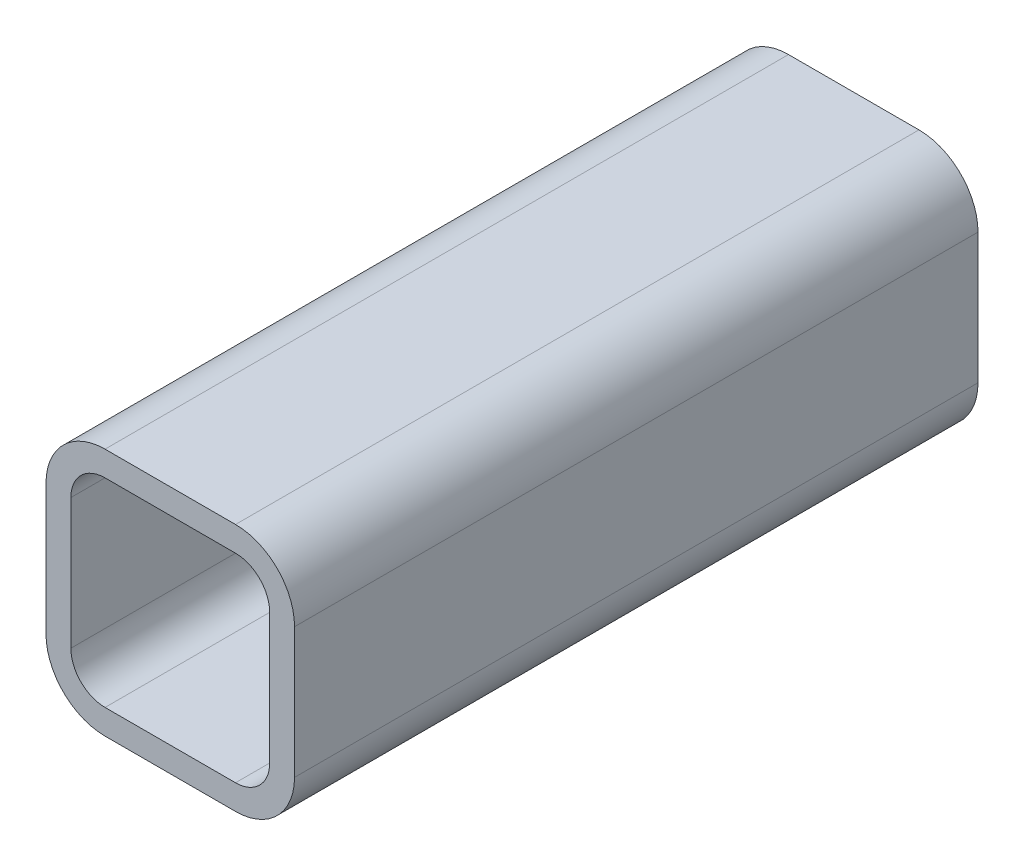
ISO-10303-21;
HEADER;
FILE_DESCRIPTION(('STEP AP214'),'2;1');
FILE_NAME('part.step','',(''),(''),'','','');
FILE_SCHEMA(('AUTOMOTIVE_DESIGN { 1 0 10303 214 1 1 1 1 }'));
ENDSEC;
DATA;
#1=APPLICATION_CONTEXT('core data for automotive mechanical design processes');
#2=APPLICATION_PROTOCOL_DEFINITION('international standard','automotive_design',2000,#1);
#3=PRODUCT_CONTEXT('',#1,'mechanical');
#4=PRODUCT('Part','Part','',(#3));
#5=PRODUCT_RELATED_PRODUCT_CATEGORY('part','',(#4));
#6=PRODUCT_DEFINITION_FORMATION('','',#4);
#7=PRODUCT_DEFINITION_CONTEXT('part definition',#1,'design');
#8=PRODUCT_DEFINITION('design','',#6,#7);
#9=PRODUCT_DEFINITION_SHAPE('','',#8);
#10=(LENGTH_UNIT() NAMED_UNIT(*) SI_UNIT(.MILLI.,.METRE.));
#11=(NAMED_UNIT(*) PLANE_ANGLE_UNIT() SI_UNIT($,.RADIAN.));
#12=(NAMED_UNIT(*) SI_UNIT($,.STERADIAN.) SOLID_ANGLE_UNIT());
#13=UNCERTAINTY_MEASURE_WITH_UNIT(LENGTH_MEASURE(1.E-05),#10,'distance_accuracy_value','');
#14=(GEOMETRIC_REPRESENTATION_CONTEXT(3) GLOBAL_UNCERTAINTY_ASSIGNED_CONTEXT((#13)) GLOBAL_UNIT_ASSIGNED_CONTEXT((#10,
#11,#12)) REPRESENTATION_CONTEXT('',''));
#15=CARTESIAN_POINT('',(0.,0.,0.));
#16=DIRECTION('',(0.,0.,1.));
#17=DIRECTION('',(1.,0.,0.));
#18=AXIS2_PLACEMENT_3D('',#15,#16,#17);
#19=CARTESIAN_POINT('',(-21.,-21.,110.));
#20=DIRECTION('',(0.,0.,1.));
#21=DIRECTION('',(1.,0.,0.));
#22=AXIS2_PLACEMENT_3D('',#19,#20,#21);
#23=PLANE('',#22);
#24=CARTESIAN_POINT('',(-21.,-21.,110.));
#25=DIRECTION('',(0.,0.,1.));
#26=DIRECTION('',(1.,0.,0.));
#27=AXIS2_PLACEMENT_3D('',#24,#25,#26);
#28=CIRCLE('',#27,19.);
#29=CARTESIAN_POINT('',(-39.9999999999999,-20.9999999999999,110.));
#30=VERTEX_POINT('',#29);
#31=CARTESIAN_POINT('',(-20.9999999999999,-40.,110.));
#32=VERTEX_POINT('',#31);
#33=EDGE_CURVE('E216',#30,#32,#28,.T.);
#34=ORIENTED_EDGE('',*,*,#33,.T.);
#35=DIRECTION('',(1.,0.,0.));
#36=VECTOR('',#35,1.);
#37=CARTESIAN_POINT('',(-20.9999999999999,-40.,110.));
#38=LINE('',#37,#36);
#39=CARTESIAN_POINT('',(20.9999999999999,-40.,110.));
#40=VERTEX_POINT('',#39);
#41=EDGE_CURVE('E219',#32,#40,#38,.T.);
#42=ORIENTED_EDGE('',*,*,#41,.T.);
#43=CARTESIAN_POINT('',(21.,-21.,110.));
#44=DIRECTION('',(0.,0.,1.));
#45=DIRECTION('',(1.,0.,0.));
#46=AXIS2_PLACEMENT_3D('',#43,#44,#45);
#47=CIRCLE('',#46,19.);
#48=CARTESIAN_POINT('',(40.0000000000001,-20.9999999999999,110.));
#49=VERTEX_POINT('',#48);
#50=EDGE_CURVE('E222',#40,#49,#47,.T.);
#51=ORIENTED_EDGE('',*,*,#50,.T.);
#52=DIRECTION('',(0.,1.,0.));
#53=VECTOR('',#52,1.);
#54=CARTESIAN_POINT('',(40.0000000000001,20.9999999999999,110.));
#55=LINE('',#54,#53);
#56=CARTESIAN_POINT('',(40.0000000000001,20.9999999999999,110.));
#57=VERTEX_POINT('',#56);
#58=EDGE_CURVE('E224',#49,#57,#55,.T.);
#59=ORIENTED_EDGE('',*,*,#58,.T.);
#60=CARTESIAN_POINT('',(21.,21.,110.));
#61=DIRECTION('',(0.,0.,1.));
#62=DIRECTION('',(1.,0.,0.));
#63=AXIS2_PLACEMENT_3D('',#60,#61,#62);
#64=CIRCLE('',#63,19.);
#65=CARTESIAN_POINT('',(20.9999999999999,40.,110.));
#66=VERTEX_POINT('',#65);
#67=EDGE_CURVE('E226',#57,#66,#64,.T.);
#68=ORIENTED_EDGE('',*,*,#67,.T.);
#69=DIRECTION('',(-1.,0.,0.));
#70=VECTOR('',#69,1.);
#71=CARTESIAN_POINT('',(-20.9999999999999,40.,110.));
#72=LINE('',#71,#70);
#73=CARTESIAN_POINT('',(-20.9999999999999,40.,110.));
#74=VERTEX_POINT('',#73);
#75=EDGE_CURVE('E228',#66,#74,#72,.T.);
#76=ORIENTED_EDGE('',*,*,#75,.T.);
#77=CARTESIAN_POINT('',(-21.,21.,110.));
#78=DIRECTION('',(0.,0.,1.));
#79=DIRECTION('',(1.,0.,0.));
#80=AXIS2_PLACEMENT_3D('',#77,#78,#79);
#81=CIRCLE('',#80,19.);
#82=CARTESIAN_POINT('',(-39.9999999999999,20.9999999999999,110.));
#83=VERTEX_POINT('',#82);
#84=EDGE_CURVE('E230',#74,#83,#81,.T.);
#85=ORIENTED_EDGE('',*,*,#84,.T.);
#86=DIRECTION('',(0.,-1.,0.));
#87=VECTOR('',#86,1.);
#88=CARTESIAN_POINT('',(-39.9999999999999,20.9999999999999,110.));
#89=LINE('',#88,#87);
#90=EDGE_CURVE('E232',#83,#30,#89,.T.);
#91=ORIENTED_EDGE('',*,*,#90,.T.);
#92=EDGE_LOOP('',(#34,#42,#51,#59,#68,#76,#85,#91));
#93=FACE_BOUND('',#92,.T.);
#94=DIRECTION('',(0.,-1.,0.));
#95=VECTOR('',#94,1.);
#96=CARTESIAN_POINT('',(-31.9999999999999,20.9999999999999,110.));
#97=LINE('',#96,#95);
#98=CARTESIAN_POINT('',(-31.9999999999999,20.9999999999999,110.));
#99=VERTEX_POINT('',#98);
#100=CARTESIAN_POINT('',(-31.9999999999999,-20.9999999999999,110.));
#101=VERTEX_POINT('',#100);
#102=EDGE_CURVE('E157',#99,#101,#97,.T.);
#103=ORIENTED_EDGE('',*,*,#102,.F.);
#104=CARTESIAN_POINT('',(-21.,21.,110.));
#105=DIRECTION('',(0.,0.,1.));
#106=DIRECTION('',(1.,0.,0.));
#107=AXIS2_PLACEMENT_3D('',#104,#105,#106);
#108=CIRCLE('',#107,11.);
#109=CARTESIAN_POINT('',(-20.9999999999999,32.,110.));
#110=VERTEX_POINT('',#109);
#111=EDGE_CURVE('E149',#110,#99,#108,.T.);
#112=ORIENTED_EDGE('',*,*,#111,.F.);
#113=DIRECTION('',(-1.,0.,0.));
#114=VECTOR('',#113,1.);
#115=CARTESIAN_POINT('',(-20.9999999999999,32.,110.));
#116=LINE('',#115,#114);
#117=CARTESIAN_POINT('',(20.9999999999999,32.,110.));
#118=VERTEX_POINT('',#117);
#119=EDGE_CURVE('E183',#118,#110,#116,.T.);
#120=ORIENTED_EDGE('',*,*,#119,.F.);
#121=CARTESIAN_POINT('',(21.,21.,110.));
#122=DIRECTION('',(0.,0.,1.));
#123=DIRECTION('',(1.,0.,0.));
#124=AXIS2_PLACEMENT_3D('',#121,#122,#123);
#125=CIRCLE('',#124,11.);
#126=CARTESIAN_POINT('',(32.0000000000001,20.9999999999999,110.));
#127=VERTEX_POINT('',#126);
#128=EDGE_CURVE('E181',#127,#118,#125,.T.);
#129=ORIENTED_EDGE('',*,*,#128,.F.);
#130=DIRECTION('',(0.,1.,0.));
#131=VECTOR('',#130,1.);
#132=CARTESIAN_POINT('',(32.0000000000001,20.9999999999999,110.));
#133=LINE('',#132,#131);
#134=CARTESIAN_POINT('',(32.0000000000001,-21.,110.));
#135=VERTEX_POINT('',#134);
#136=EDGE_CURVE('E179',#135,#127,#133,.T.);
#137=ORIENTED_EDGE('',*,*,#136,.F.);
#138=CARTESIAN_POINT('',(21.,-21.,110.));
#139=DIRECTION('',(0.,0.,1.));
#140=DIRECTION('',(1.,0.,0.));
#141=AXIS2_PLACEMENT_3D('',#138,#139,#140);
#142=CIRCLE('',#141,11.);
#143=CARTESIAN_POINT('',(20.9999999999999,-32.,110.));
#144=VERTEX_POINT('',#143);
#145=EDGE_CURVE('E177',#144,#135,#142,.T.);
#146=ORIENTED_EDGE('',*,*,#145,.F.);
#147=DIRECTION('',(1.,0.,0.));
#148=VECTOR('',#147,1.);
#149=CARTESIAN_POINT('',(-20.9999999999999,-32.,110.));
#150=LINE('',#149,#148);
#151=CARTESIAN_POINT('',(-20.9999999999999,-32.,110.));
#152=VERTEX_POINT('',#151);
#153=EDGE_CURVE('E172',#152,#144,#150,.T.);
#154=ORIENTED_EDGE('',*,*,#153,.F.);
#155=CARTESIAN_POINT('',(-21.,-21.,110.));
#156=DIRECTION('',(0.,0.,1.));
#157=DIRECTION('',(1.,0.,0.));
#158=AXIS2_PLACEMENT_3D('',#155,#156,#157);
#159=CIRCLE('',#158,11.);
#160=EDGE_CURVE('E170',#101,#152,#159,.T.);
#161=ORIENTED_EDGE('',*,*,#160,.F.);
#162=EDGE_LOOP('',(#103,#112,#120,#129,#137,#146,#154,#161));
#163=FACE_BOUND('',#162,.T.);
#164=ADVANCED_FACE('F36',(#93,#163),#23,.T.);
#165=CARTESIAN_POINT('',(-21.,-21.,-110.));
#166=DIRECTION('',(0.,0.,1.));
#167=DIRECTION('',(1.,0.,0.));
#168=AXIS2_PLACEMENT_3D('',#165,#166,#167);
#169=PLANE('',#168);
#170=CARTESIAN_POINT('',(-21.,-21.,-110.));
#171=DIRECTION('',(0.,0.,1.));
#172=DIRECTION('',(1.,0.,0.));
#173=AXIS2_PLACEMENT_3D('',#170,#171,#172);
#174=CIRCLE('',#173,19.);
#175=CARTESIAN_POINT('',(-39.9999999999999,-20.9999999999999,-110.));
#176=VERTEX_POINT('',#175);
#177=CARTESIAN_POINT('',(-20.9999999999999,-40.,-110.));
#178=VERTEX_POINT('',#177);
#179=EDGE_CURVE('E165',#176,#178,#174,.T.);
#180=ORIENTED_EDGE('',*,*,#179,.F.);
#181=DIRECTION('',(0.,-1.,0.));
#182=VECTOR('',#181,1.);
#183=CARTESIAN_POINT('',(-39.9999999999999,20.9999999999999,-110.));
#184=LINE('',#183,#182);
#185=CARTESIAN_POINT('',(-39.9999999999999,20.9999999999999,-110.));
#186=VERTEX_POINT('',#185);
#187=EDGE_CURVE('E220',#186,#176,#184,.T.);
#188=ORIENTED_EDGE('',*,*,#187,.F.);
#189=CARTESIAN_POINT('',(-21.,21.,-110.));
#190=DIRECTION('',(0.,0.,1.));
#191=DIRECTION('',(1.,0.,0.));
#192=AXIS2_PLACEMENT_3D('',#189,#190,#191);
#193=CIRCLE('',#192,19.);
#194=CARTESIAN_POINT('',(-20.9999999999999,40.,-110.));
#195=VERTEX_POINT('',#194);
#196=EDGE_CURVE('E247',#195,#186,#193,.T.);
#197=ORIENTED_EDGE('',*,*,#196,.F.);
#198=DIRECTION('',(-1.,0.,0.));
#199=VECTOR('',#198,1.);
#200=CARTESIAN_POINT('',(-20.9999999999999,40.,-110.));
#201=LINE('',#200,#199);
#202=CARTESIAN_POINT('',(20.9999999999999,40.,-110.));
#203=VERTEX_POINT('',#202);
#204=EDGE_CURVE('E245',#203,#195,#201,.T.);
#205=ORIENTED_EDGE('',*,*,#204,.F.);
#206=CARTESIAN_POINT('',(21.,21.,-110.));
#207=DIRECTION('',(0.,0.,1.));
#208=DIRECTION('',(1.,0.,0.));
#209=AXIS2_PLACEMENT_3D('',#206,#207,#208);
#210=CIRCLE('',#209,19.);
#211=CARTESIAN_POINT('',(40.0000000000001,20.9999999999999,-110.));
#212=VERTEX_POINT('',#211);
#213=EDGE_CURVE('E243',#212,#203,#210,.T.);
#214=ORIENTED_EDGE('',*,*,#213,.F.);
#215=DIRECTION('',(0.,1.,0.));
#216=VECTOR('',#215,1.);
#217=CARTESIAN_POINT('',(40.0000000000001,20.9999999999999,-110.));
#218=LINE('',#217,#216);
#219=CARTESIAN_POINT('',(40.0000000000001,-20.9999999999999,-110.));
#220=VERTEX_POINT('',#219);
#221=EDGE_CURVE('E241',#220,#212,#218,.T.);
#222=ORIENTED_EDGE('',*,*,#221,.F.);
#223=CARTESIAN_POINT('',(21.,-21.,-110.));
#224=DIRECTION('',(0.,0.,1.));
#225=DIRECTION('',(1.,0.,0.));
#226=AXIS2_PLACEMENT_3D('',#223,#224,#225);
#227=CIRCLE('',#226,19.);
#228=CARTESIAN_POINT('',(20.9999999999999,-40.,-110.));
#229=VERTEX_POINT('',#228);
#230=EDGE_CURVE('E239',#229,#220,#227,.T.);
#231=ORIENTED_EDGE('',*,*,#230,.F.);
#232=DIRECTION('',(1.,0.,0.));
#233=VECTOR('',#232,1.);
#234=CARTESIAN_POINT('',(-20.9999999999999,-40.,-110.));
#235=LINE('',#234,#233);
#236=EDGE_CURVE('E237',#178,#229,#235,.T.);
#237=ORIENTED_EDGE('',*,*,#236,.F.);
#238=EDGE_LOOP('',(#180,#188,#197,#205,#214,#222,#231,#237));
#239=FACE_BOUND('',#238,.T.);
#240=CARTESIAN_POINT('',(-21.,21.,-110.));
#241=DIRECTION('',(0.,0.,1.));
#242=DIRECTION('',(1.,0.,0.));
#243=AXIS2_PLACEMENT_3D('',#240,#241,#242);
#244=CIRCLE('',#243,11.);
#245=CARTESIAN_POINT('',(-20.9999999999999,32.,-110.));
#246=VERTEX_POINT('',#245);
#247=CARTESIAN_POINT('',(-31.9999999999999,20.9999999999999,-110.));
#248=VERTEX_POINT('',#247);
#249=EDGE_CURVE('E59',#246,#248,#244,.T.);
#250=ORIENTED_EDGE('',*,*,#249,.T.);
#251=DIRECTION('',(0.,-1.,0.));
#252=VECTOR('',#251,1.);
#253=CARTESIAN_POINT('',(-31.9999999999999,20.9999999999999,-110.));
#254=LINE('',#253,#252);
#255=CARTESIAN_POINT('',(-31.9999999999999,-20.9999999999999,-110.));
#256=VERTEX_POINT('',#255);
#257=EDGE_CURVE('E164',#248,#256,#254,.T.);
#258=ORIENTED_EDGE('',*,*,#257,.T.);
#259=CARTESIAN_POINT('',(-21.,-21.,-110.));
#260=DIRECTION('',(0.,0.,1.));
#261=DIRECTION('',(1.,0.,0.));
#262=AXIS2_PLACEMENT_3D('',#259,#260,#261);
#263=CIRCLE('',#262,11.);
#264=CARTESIAN_POINT('',(-20.9999999999999,-32.,-110.));
#265=VERTEX_POINT('',#264);
#266=EDGE_CURVE('E188',#256,#265,#263,.T.);
#267=ORIENTED_EDGE('',*,*,#266,.T.);
#268=DIRECTION('',(1.,0.,0.));
#269=VECTOR('',#268,1.);
#270=CARTESIAN_POINT('',(-20.9999999999999,-32.,-110.));
#271=LINE('',#270,#269);
#272=CARTESIAN_POINT('',(20.9999999999999,-32.,-110.));
#273=VERTEX_POINT('',#272);
#274=EDGE_CURVE('E191',#265,#273,#271,.T.);
#275=ORIENTED_EDGE('',*,*,#274,.T.);
#276=CARTESIAN_POINT('',(21.,-21.,-110.));
#277=DIRECTION('',(0.,0.,1.));
#278=DIRECTION('',(1.,0.,0.));
#279=AXIS2_PLACEMENT_3D('',#276,#277,#278);
#280=CIRCLE('',#279,11.);
#281=CARTESIAN_POINT('',(32.0000000000001,-21.,-110.));
#282=VERTEX_POINT('',#281);
#283=EDGE_CURVE('E194',#273,#282,#280,.T.);
#284=ORIENTED_EDGE('',*,*,#283,.T.);
#285=DIRECTION('',(0.,1.,0.));
#286=VECTOR('',#285,1.);
#287=CARTESIAN_POINT('',(32.0000000000001,20.9999999999999,-110.));
#288=LINE('',#287,#286);
#289=CARTESIAN_POINT('',(32.0000000000001,20.9999999999999,-110.));
#290=VERTEX_POINT('',#289);
#291=EDGE_CURVE('E197',#282,#290,#288,.T.);
#292=ORIENTED_EDGE('',*,*,#291,.T.);
#293=CARTESIAN_POINT('',(21.,21.,-110.));
#294=DIRECTION('',(0.,0.,1.));
#295=DIRECTION('',(1.,0.,0.));
#296=AXIS2_PLACEMENT_3D('',#293,#294,#295);
#297=CIRCLE('',#296,11.);
#298=CARTESIAN_POINT('',(20.9999999999999,32.,-110.));
#299=VERTEX_POINT('',#298);
#300=EDGE_CURVE('E200',#290,#299,#297,.T.);
#301=ORIENTED_EDGE('',*,*,#300,.T.);
#302=DIRECTION('',(-1.,0.,0.));
#303=VECTOR('',#302,1.);
#304=CARTESIAN_POINT('',(-20.9999999999999,32.,-110.));
#305=LINE('',#304,#303);
#306=EDGE_CURVE('E158',#299,#246,#305,.T.);
#307=ORIENTED_EDGE('',*,*,#306,.T.);
#308=EDGE_LOOP('',(#250,#258,#267,#275,#284,#292,#301,#307));
#309=FACE_BOUND('',#308,.T.);
#310=ADVANCED_FACE('F277',(#239,#309),#169,.F.);
#311=CARTESIAN_POINT('',(-21.,-21.,110.));
#312=DIRECTION('',(0.,0.,-1.));
#313=DIRECTION('',(-1.,0.,0.));
#314=AXIS2_PLACEMENT_3D('',#311,#312,#313);
#315=CYLINDRICAL_SURFACE('',#314,19.);
#316=ORIENTED_EDGE('',*,*,#179,.T.);
#317=DIRECTION('',(0.,0.,-1.));
#318=VECTOR('',#317,1.);
#319=CARTESIAN_POINT('',(-20.9999999999999,-40.,110.));
#320=LINE('',#319,#318);
#321=EDGE_CURVE('E11',#32,#178,#320,.T.);
#322=ORIENTED_EDGE('',*,*,#321,.F.);
#323=ORIENTED_EDGE('',*,*,#33,.F.);
#324=DIRECTION('',(0.,0.,-1.));
#325=VECTOR('',#324,1.);
#326=CARTESIAN_POINT('',(-39.9999999999999,-20.9999999999999,110.));
#327=LINE('',#326,#325);
#328=EDGE_CURVE('E234',#30,#176,#327,.T.);
#329=ORIENTED_EDGE('',*,*,#328,.T.);
#330=EDGE_LOOP('',(#316,#322,#323,#329));
#331=FACE_BOUND('',#330,.T.);
#332=ADVANCED_FACE('F38',(#331),#315,.T.);
#333=CARTESIAN_POINT('',(-20.9999999999999,-40.,110.));
#334=DIRECTION('',(0.,1.,0.));
#335=DIRECTION('',(0.,0.,1.));
#336=AXIS2_PLACEMENT_3D('',#333,#334,#335);
#337=PLANE('',#336);
#338=CARTESIAN_POINT('',(0.,-40.,0.));
#339=DIRECTION('',(0.,-1.,0.));
#340=DIRECTION('',(0.,0.,-1.));
#341=AXIS2_PLACEMENT_3D('',#338,#339,#340);
#342=CIRCLE('',#341,4.49999999999999);
#343=CARTESIAN_POINT('',(0.,-40.,-4.49999999999999));
#344=VERTEX_POINT('',#343);
#345=EDGE_CURVE('E368',#344,#344,#342,.T.);
#346=ORIENTED_EDGE('',*,*,#345,.F.);
#347=EDGE_LOOP('',(#346));
#348=FACE_BOUND('',#347,.T.);
#349=ORIENTED_EDGE('',*,*,#236,.T.);
#350=DIRECTION('',(0.,0.,-1.));
#351=VECTOR('',#350,1.);
#352=CARTESIAN_POINT('',(20.9999999999999,-40.,110.));
#353=LINE('',#352,#351);
#354=EDGE_CURVE('E44',#40,#229,#353,.T.);
#355=ORIENTED_EDGE('',*,*,#354,.F.);
#356=ORIENTED_EDGE('',*,*,#41,.F.);
#357=ORIENTED_EDGE('',*,*,#321,.T.);
#358=EDGE_LOOP('',(#349,#355,#356,#357));
#359=FACE_BOUND('',#358,.T.);
#360=ADVANCED_FACE('F294',(#348,#359),#337,.F.);
#361=CARTESIAN_POINT('',(21.,-21.,110.));
#362=DIRECTION('',(0.,0.,-1.));
#363=DIRECTION('',(-1.,0.,0.));
#364=AXIS2_PLACEMENT_3D('',#361,#362,#363);
#365=CYLINDRICAL_SURFACE('',#364,19.);
#366=ORIENTED_EDGE('',*,*,#230,.T.);
#367=DIRECTION('',(0.,0.,-1.));
#368=VECTOR('',#367,1.);
#369=CARTESIAN_POINT('',(40.0000000000001,-20.9999999999999,110.));
#370=LINE('',#369,#368);
#371=EDGE_CURVE('E264',#49,#220,#370,.T.);
#372=ORIENTED_EDGE('',*,*,#371,.F.);
#373=ORIENTED_EDGE('',*,*,#50,.F.);
#374=ORIENTED_EDGE('',*,*,#354,.T.);
#375=EDGE_LOOP('',(#366,#372,#373,#374));
#376=FACE_BOUND('',#375,.T.);
#377=ADVANCED_FACE('F271',(#376),#365,.T.);
#378=CARTESIAN_POINT('',(40.0000000000001,20.9999999999999,110.));
#379=DIRECTION('',(-1.,0.,0.));
#380=DIRECTION('',(0.,-1.,0.));
#381=AXIS2_PLACEMENT_3D('',#378,#379,#380);
#382=PLANE('',#381);
#383=ORIENTED_EDGE('',*,*,#221,.T.);
#384=DIRECTION('',(0.,0.,-1.));
#385=VECTOR('',#384,1.);
#386=CARTESIAN_POINT('',(40.0000000000001,20.9999999999999,110.));
#387=LINE('',#386,#385);
#388=EDGE_CURVE('E261',#57,#212,#387,.T.);
#389=ORIENTED_EDGE('',*,*,#388,.F.);
#390=ORIENTED_EDGE('',*,*,#58,.F.);
#391=ORIENTED_EDGE('',*,*,#371,.T.);
#392=EDGE_LOOP('',(#383,#389,#390,#391));
#393=FACE_BOUND('',#392,.T.);
#394=ADVANCED_FACE('F283',(#393),#382,.F.);
#395=CARTESIAN_POINT('',(21.,21.,110.));
#396=DIRECTION('',(0.,0.,-1.));
#397=DIRECTION('',(-1.,0.,0.));
#398=AXIS2_PLACEMENT_3D('',#395,#396,#397);
#399=CYLINDRICAL_SURFACE('',#398,19.);
#400=ORIENTED_EDGE('',*,*,#213,.T.);
#401=DIRECTION('',(0.,0.,-1.));
#402=VECTOR('',#401,1.);
#403=CARTESIAN_POINT('',(20.9999999999999,40.,110.));
#404=LINE('',#403,#402);
#405=EDGE_CURVE('E258',#66,#203,#404,.T.);
#406=ORIENTED_EDGE('',*,*,#405,.F.);
#407=ORIENTED_EDGE('',*,*,#67,.F.);
#408=ORIENTED_EDGE('',*,*,#388,.T.);
#409=EDGE_LOOP('',(#400,#406,#407,#408));
#410=FACE_BOUND('',#409,.T.);
#411=ADVANCED_FACE('F287',(#410),#399,.T.);
#412=CARTESIAN_POINT('',(-20.9999999999999,40.,110.));
#413=DIRECTION('',(0.,-1.,0.));
#414=DIRECTION('',(0.,0.,-1.));
#415=AXIS2_PLACEMENT_3D('',#412,#413,#414);
#416=PLANE('',#415);
#417=ORIENTED_EDGE('',*,*,#204,.T.);
#418=DIRECTION('',(0.,0.,-1.));
#419=VECTOR('',#418,1.);
#420=CARTESIAN_POINT('',(-20.9999999999999,40.,110.));
#421=LINE('',#420,#419);
#422=EDGE_CURVE('E255',#74,#195,#421,.T.);
#423=ORIENTED_EDGE('',*,*,#422,.F.);
#424=ORIENTED_EDGE('',*,*,#75,.F.);
#425=ORIENTED_EDGE('',*,*,#405,.T.);
#426=EDGE_LOOP('',(#417,#423,#424,#425));
#427=FACE_BOUND('',#426,.T.);
#428=ADVANCED_FACE('F307',(#427),#416,.F.);
#429=CARTESIAN_POINT('',(-21.,21.,110.));
#430=DIRECTION('',(0.,0.,-1.));
#431=DIRECTION('',(-1.,0.,0.));
#432=AXIS2_PLACEMENT_3D('',#429,#430,#431);
#433=CYLINDRICAL_SURFACE('',#432,19.);
#434=ORIENTED_EDGE('',*,*,#196,.T.);
#435=DIRECTION('',(0.,0.,-1.));
#436=VECTOR('',#435,1.);
#437=CARTESIAN_POINT('',(-39.9999999999999,20.9999999999999,110.));
#438=LINE('',#437,#436);
#439=EDGE_CURVE('E252',#83,#186,#438,.T.);
#440=ORIENTED_EDGE('',*,*,#439,.F.);
#441=ORIENTED_EDGE('',*,*,#84,.F.);
#442=ORIENTED_EDGE('',*,*,#422,.T.);
#443=EDGE_LOOP('',(#434,#440,#441,#442));
#444=FACE_BOUND('',#443,.T.);
#445=ADVANCED_FACE('F305',(#444),#433,.T.);
#446=CARTESIAN_POINT('',(-39.9999999999999,20.9999999999999,110.));
#447=DIRECTION('',(1.,0.,0.));
#448=DIRECTION('',(0.,0.,-1.));
#449=AXIS2_PLACEMENT_3D('',#446,#447,#448);
#450=PLANE('',#449);
#451=ORIENTED_EDGE('',*,*,#187,.T.);
#452=ORIENTED_EDGE('',*,*,#328,.F.);
#453=ORIENTED_EDGE('',*,*,#90,.F.);
#454=ORIENTED_EDGE('',*,*,#439,.T.);
#455=EDGE_LOOP('',(#451,#452,#453,#454));
#456=FACE_BOUND('',#455,.T.);
#457=ADVANCED_FACE('F300',(#456),#450,.F.);
#458=CARTESIAN_POINT('',(-21.,21.,110.));
#459=DIRECTION('',(0.,0.,-1.));
#460=DIRECTION('',(-1.,0.,0.));
#461=AXIS2_PLACEMENT_3D('',#458,#459,#460);
#462=CYLINDRICAL_SURFACE('',#461,11.);
#463=ORIENTED_EDGE('',*,*,#249,.F.);
#464=DIRECTION('',(0.,0.,-1.));
#465=VECTOR('',#464,1.);
#466=CARTESIAN_POINT('',(-20.9999999999999,32.,110.));
#467=LINE('',#466,#465);
#468=EDGE_CURVE('E153',#110,#246,#467,.T.);
#469=ORIENTED_EDGE('',*,*,#468,.F.);
#470=ORIENTED_EDGE('',*,*,#111,.T.);
#471=DIRECTION('',(0.,0.,-1.));
#472=VECTOR('',#471,1.);
#473=CARTESIAN_POINT('',(-31.9999999999999,20.9999999999999,110.));
#474=LINE('',#473,#472);
#475=EDGE_CURVE('E152',#99,#248,#474,.T.);
#476=ORIENTED_EDGE('',*,*,#475,.T.);
#477=EDGE_LOOP('',(#463,#469,#470,#476));
#478=FACE_BOUND('',#477,.T.);
#479=ADVANCED_FACE('F151',(#478),#462,.F.);
#480=CARTESIAN_POINT('',(-31.9999999999999,20.9999999999999,110.));
#481=DIRECTION('',(1.,0.,0.));
#482=DIRECTION('',(0.,0.,-1.));
#483=AXIS2_PLACEMENT_3D('',#480,#481,#482);
#484=PLANE('',#483);
#485=ORIENTED_EDGE('',*,*,#257,.F.);
#486=ORIENTED_EDGE('',*,*,#475,.F.);
#487=ORIENTED_EDGE('',*,*,#102,.T.);
#488=DIRECTION('',(0.,0.,-1.));
#489=VECTOR('',#488,1.);
#490=CARTESIAN_POINT('',(-31.9999999999999,-20.9999999999999,110.));
#491=LINE('',#490,#489);
#492=EDGE_CURVE('E166',#101,#256,#491,.T.);
#493=ORIENTED_EDGE('',*,*,#492,.T.);
#494=EDGE_LOOP('',(#485,#486,#487,#493));
#495=FACE_BOUND('',#494,.T.);
#496=ADVANCED_FACE('F161',(#495),#484,.T.);
#497=CARTESIAN_POINT('',(-21.,-21.,110.));
#498=DIRECTION('',(0.,0.,-1.));
#499=DIRECTION('',(-1.,0.,0.));
#500=AXIS2_PLACEMENT_3D('',#497,#498,#499);
#501=CYLINDRICAL_SURFACE('',#500,11.);
#502=ORIENTED_EDGE('',*,*,#266,.F.);
#503=ORIENTED_EDGE('',*,*,#492,.F.);
#504=ORIENTED_EDGE('',*,*,#160,.T.);
#505=DIRECTION('',(0.,0.,-1.));
#506=VECTOR('',#505,1.);
#507=CARTESIAN_POINT('',(-20.9999999999999,-32.,110.));
#508=LINE('',#507,#506);
#509=EDGE_CURVE('E213',#152,#265,#508,.T.);
#510=ORIENTED_EDGE('',*,*,#509,.T.);
#511=EDGE_LOOP('',(#502,#503,#504,#510));
#512=FACE_BOUND('',#511,.T.);
#513=ADVANCED_FACE('F332',(#512),#501,.F.);
#514=CARTESIAN_POINT('',(-20.9999999999999,-32.,110.));
#515=DIRECTION('',(0.,1.,0.));
#516=DIRECTION('',(0.,0.,1.));
#517=AXIS2_PLACEMENT_3D('',#514,#515,#516);
#518=PLANE('',#517);
#519=CARTESIAN_POINT('',(0.,-32.,0.));
#520=DIRECTION('',(0.,1.,0.));
#521=DIRECTION('',(0.,0.,1.));
#522=AXIS2_PLACEMENT_3D('',#519,#520,#521);
#523=CIRCLE('',#522,4.49999999999999);
#524=CARTESIAN_POINT('',(0.,-32.,4.49999999999999));
#525=VERTEX_POINT('',#524);
#526=EDGE_CURVE('E186',#525,#525,#523,.T.);
#527=ORIENTED_EDGE('',*,*,#526,.F.);
#528=EDGE_LOOP('',(#527));
#529=FACE_BOUND('',#528,.T.);
#530=ORIENTED_EDGE('',*,*,#274,.F.);
#531=ORIENTED_EDGE('',*,*,#509,.F.);
#532=ORIENTED_EDGE('',*,*,#153,.T.);
#533=DIRECTION('',(0.,0.,-1.));
#534=VECTOR('',#533,1.);
#535=CARTESIAN_POINT('',(20.9999999999999,-32.,110.));
#536=LINE('',#535,#534);
#537=EDGE_CURVE('E211',#144,#273,#536,.T.);
#538=ORIENTED_EDGE('',*,*,#537,.T.);
#539=EDGE_LOOP('',(#530,#531,#532,#538));
#540=FACE_BOUND('',#539,.T.);
#541=ADVANCED_FACE('F336',(#529,#540),#518,.T.);
#542=CARTESIAN_POINT('',(21.,-21.,110.));
#543=DIRECTION('',(0.,0.,-1.));
#544=DIRECTION('',(-1.,0.,0.));
#545=AXIS2_PLACEMENT_3D('',#542,#543,#544);
#546=CYLINDRICAL_SURFACE('',#545,11.);
#547=ORIENTED_EDGE('',*,*,#283,.F.);
#548=ORIENTED_EDGE('',*,*,#537,.F.);
#549=ORIENTED_EDGE('',*,*,#145,.T.);
#550=DIRECTION('',(0.,0.,-1.));
#551=VECTOR('',#550,1.);
#552=CARTESIAN_POINT('',(32.0000000000001,-21.,110.));
#553=LINE('',#552,#551);
#554=EDGE_CURVE('E209',#135,#282,#553,.T.);
#555=ORIENTED_EDGE('',*,*,#554,.T.);
#556=EDGE_LOOP('',(#547,#548,#549,#555));
#557=FACE_BOUND('',#556,.T.);
#558=ADVANCED_FACE('F342',(#557),#546,.F.);
#559=CARTESIAN_POINT('',(32.0000000000001,20.9999999999999,110.));
#560=DIRECTION('',(-1.,0.,0.));
#561=DIRECTION('',(0.,-1.,0.));
#562=AXIS2_PLACEMENT_3D('',#559,#560,#561);
#563=PLANE('',#562);
#564=ORIENTED_EDGE('',*,*,#291,.F.);
#565=ORIENTED_EDGE('',*,*,#554,.F.);
#566=ORIENTED_EDGE('',*,*,#136,.T.);
#567=DIRECTION('',(0.,0.,-1.));
#568=VECTOR('',#567,1.);
#569=CARTESIAN_POINT('',(32.0000000000001,20.9999999999999,110.));
#570=LINE('',#569,#568);
#571=EDGE_CURVE('E207',#127,#290,#570,.T.);
#572=ORIENTED_EDGE('',*,*,#571,.T.);
#573=EDGE_LOOP('',(#564,#565,#566,#572));
#574=FACE_BOUND('',#573,.T.);
#575=ADVANCED_FACE('F346',(#574),#563,.T.);
#576=CARTESIAN_POINT('',(21.,21.,110.));
#577=DIRECTION('',(0.,0.,-1.));
#578=DIRECTION('',(-1.,0.,0.));
#579=AXIS2_PLACEMENT_3D('',#576,#577,#578);
#580=CYLINDRICAL_SURFACE('',#579,11.);
#581=ORIENTED_EDGE('',*,*,#300,.F.);
#582=ORIENTED_EDGE('',*,*,#571,.F.);
#583=ORIENTED_EDGE('',*,*,#128,.T.);
#584=DIRECTION('',(0.,0.,-1.));
#585=VECTOR('',#584,1.);
#586=CARTESIAN_POINT('',(20.9999999999999,32.,110.));
#587=LINE('',#586,#585);
#588=EDGE_CURVE('E51',#118,#299,#587,.T.);
#589=ORIENTED_EDGE('',*,*,#588,.T.);
#590=EDGE_LOOP('',(#581,#582,#583,#589));
#591=FACE_BOUND('',#590,.T.);
#592=ADVANCED_FACE('F350',(#591),#580,.F.);
#593=CARTESIAN_POINT('',(-20.9999999999999,32.,110.));
#594=DIRECTION('',(0.,-1.,0.));
#595=DIRECTION('',(0.,0.,-1.));
#596=AXIS2_PLACEMENT_3D('',#593,#594,#595);
#597=PLANE('',#596);
#598=ORIENTED_EDGE('',*,*,#306,.F.);
#599=ORIENTED_EDGE('',*,*,#588,.F.);
#600=ORIENTED_EDGE('',*,*,#119,.T.);
#601=ORIENTED_EDGE('',*,*,#468,.T.);
#602=EDGE_LOOP('',(#598,#599,#600,#601));
#603=FACE_BOUND('',#602,.T.);
#604=ADVANCED_FACE('F354',(#603),#597,.T.);
#605=CARTESIAN_POINT('',(0.,-40.,0.));
#606=DIRECTION('',(0.,-1.,0.));
#607=DIRECTION('',(0.,0.,-1.));
#608=AXIS2_PLACEMENT_3D('',#605,#606,#607);
#609=CYLINDRICAL_SURFACE('',#608,4.49999999999999);
#610=ORIENTED_EDGE('',*,*,#526,.T.);
#611=EDGE_LOOP('',(#610));
#612=FACE_BOUND('',#611,.T.);
#613=ORIENTED_EDGE('',*,*,#345,.T.);
#614=EDGE_LOOP('',(#613));
#615=FACE_BOUND('',#614,.T.);
#616=ADVANCED_FACE('F358',(#612,#615),#609,.F.);
#617=CLOSED_SHELL('',(#164,#310,#332,#360,#377,#394,#411,#428,#445,#457,#479,#496,#513,#541,
#558,#575,#592,#604,#616));
#618=MANIFOLD_SOLID_BREP('B2',#617);
#619=ADVANCED_BREP_SHAPE_REPRESENTATION('',(#18,#618),#14);
#620=SHAPE_DEFINITION_REPRESENTATION(#9,#619);
ENDSEC;
END-ISO-10303-21;
